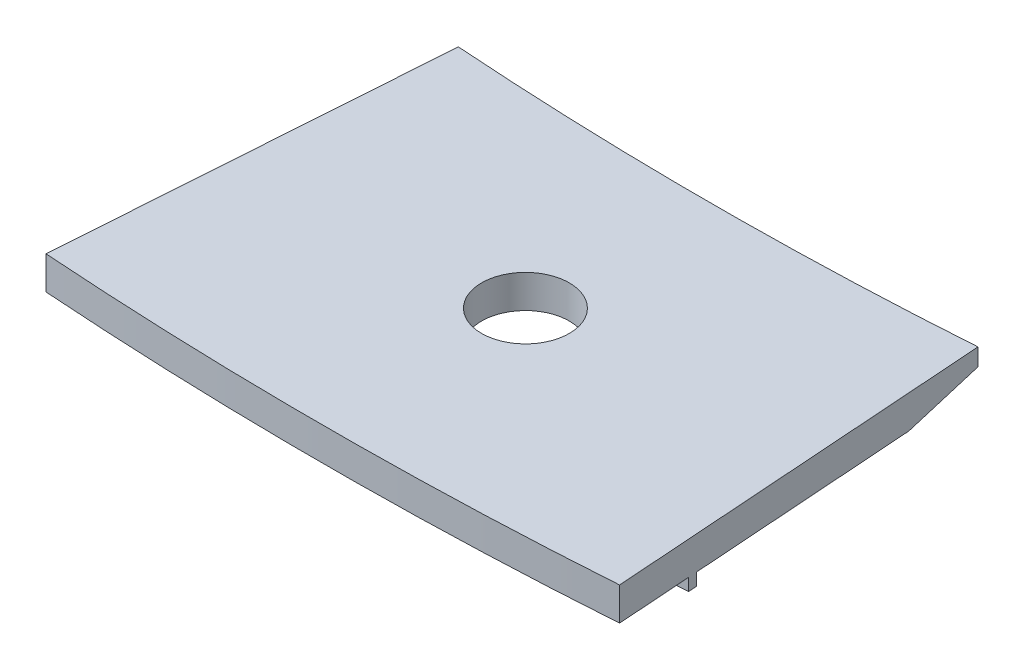
ISO-10303-21;
HEADER;
FILE_DESCRIPTION(('STEP AP214'),'2;1');
FILE_NAME('part.step','',(''),(''),'','','');
FILE_SCHEMA(('AUTOMOTIVE_DESIGN { 1 0 10303 214 1 1 1 1 }'));
ENDSEC;
DATA;
#1=APPLICATION_CONTEXT('core data for automotive mechanical design processes');
#2=APPLICATION_PROTOCOL_DEFINITION('international standard','automotive_design',2000,#1);
#3=PRODUCT_CONTEXT('',#1,'mechanical');
#4=PRODUCT('Part','Part','',(#3));
#5=PRODUCT_RELATED_PRODUCT_CATEGORY('part','',(#4));
#6=PRODUCT_DEFINITION_FORMATION('','',#4);
#7=PRODUCT_DEFINITION_CONTEXT('part definition',#1,'design');
#8=PRODUCT_DEFINITION('design','',#6,#7);
#9=PRODUCT_DEFINITION_SHAPE('','',#8);
#10=(LENGTH_UNIT() NAMED_UNIT(*) SI_UNIT(.MILLI.,.METRE.));
#11=(NAMED_UNIT(*) PLANE_ANGLE_UNIT() SI_UNIT($,.RADIAN.));
#12=(NAMED_UNIT(*) SI_UNIT($,.STERADIAN.) SOLID_ANGLE_UNIT());
#13=UNCERTAINTY_MEASURE_WITH_UNIT(LENGTH_MEASURE(1.E-05),#10,'distance_accuracy_value','');
#14=(GEOMETRIC_REPRESENTATION_CONTEXT(3) GLOBAL_UNCERTAINTY_ASSIGNED_CONTEXT((#13)) GLOBAL_UNIT_ASSIGNED_CONTEXT((#10,
#11,#12)) REPRESENTATION_CONTEXT('',''));
#15=CARTESIAN_POINT('',(0.,0.,0.));
#16=DIRECTION('',(0.,0.,1.));
#17=DIRECTION('',(1.,0.,0.));
#18=AXIS2_PLACEMENT_3D('',#15,#16,#17);
#19=CARTESIAN_POINT('',(4.61295817497898E-12,0.,-3.33066907387441E-13));
#20=DIRECTION('',(0.,-1.,0.));
#21=DIRECTION('',(0.,0.,-1.));
#22=AXIS2_PLACEMENT_3D('',#19,#20,#21);
#23=PLANE('',#22);
#24=CARTESIAN_POINT('',(0.,0.,0.));
#25=DIRECTION('',(0.,1.,0.));
#26=DIRECTION('',(0.,0.,1.));
#27=AXIS2_PLACEMENT_3D('',#24,#25,#26);
#28=CIRCLE('',#27,243.5);
#29=CARTESIAN_POINT('',(-16.9857013566948,0.,242.906846238267));
#30=VERTEX_POINT('',#29);
#31=CARTESIAN_POINT('',(16.9857013566938,0.,242.906846238267));
#32=VERTEX_POINT('',#31);
#33=EDGE_CURVE('E128',#30,#32,#28,.T.);
#34=ORIENTED_EDGE('',*,*,#33,.F.);
#35=DIRECTION('',(-0.069756473744147,0.,0.997564050259823));
#36=VECTOR('',#35,1.);
#37=CARTESIAN_POINT('',(-15.984695958467,0.,228.591802117048));
#38=LINE('',#37,#36);
#39=CARTESIAN_POINT('',(-16.0195741953391,0.,229.090584142178));
#40=VERTEX_POINT('',#39);
#41=EDGE_CURVE('E157',#40,#30,#38,.T.);
#42=ORIENTED_EDGE('',*,*,#41,.F.);
#43=CARTESIAN_POINT('',(0.,0.,0.));
#44=DIRECTION('',(0.,-1.,0.));
#45=DIRECTION('',(0.,0.,-1.));
#46=AXIS2_PLACEMENT_3D('',#43,#44,#45);
#47=CIRCLE('',#46,229.650000000009);
#48=CARTESIAN_POINT('',(16.0195741953391,0.,229.090584142178));
#49=VERTEX_POINT('',#48);
#50=EDGE_CURVE('E44',#40,#49,#47,.F.);
#51=ORIENTED_EDGE('',*,*,#50,.T.);
#52=DIRECTION('',(-0.0697564737440707,0.,-0.997564050259828));
#53=VECTOR('',#52,1.);
#54=CARTESIAN_POINT('',(15.9846959584671,0.,228.591802117049));
#55=LINE('',#54,#53);
#56=EDGE_CURVE('E51',#32,#49,#55,.T.);
#57=ORIENTED_EDGE('',*,*,#56,.F.);
#58=EDGE_LOOP('',(#34,#42,#51,#57));
#59=FACE_BOUND('',#58,.T.);
#60=CARTESIAN_POINT('',(0.,0.,236.25));
#61=DIRECTION('',(0.,1.,0.));
#62=DIRECTION('',(0.,0.,1.));
#63=AXIS2_PLACEMENT_3D('',#60,#61,#62);
#64=CIRCLE('',#63,2.65000000000001);
#65=CARTESIAN_POINT('',(0.,0.,238.9));
#66=VERTEX_POINT('',#65);
#67=EDGE_CURVE('E140',#66,#66,#64,.T.);
#68=ORIENTED_EDGE('',*,*,#67,.T.);
#69=EDGE_LOOP('',(#68));
#70=FACE_BOUND('',#69,.T.);
#71=ADVANCED_FACE('F35',(#59,#70),#23,.T.);
#72=CARTESIAN_POINT('',(4.61295817497898E-12,2.,-3.33066907387441E-13));
#73=DIRECTION('',(0.,-1.,0.));
#74=DIRECTION('',(0.,0.,-1.));
#75=AXIS2_PLACEMENT_3D('',#72,#73,#74);
#76=PLANE('',#75);
#77=DIRECTION('',(-0.0697564737440707,0.,-0.997564050259828));
#78=VECTOR('',#77,1.);
#79=CARTESIAN_POINT('',(15.9846959584671,2.,228.591802117049));
#80=LINE('',#79,#78);
#81=CARTESIAN_POINT('',(17.3344837254145,2.,247.894666489571));
#82=VERTEX_POINT('',#81);
#83=CARTESIAN_POINT('',(15.7056700634948,2.,224.601545916009));
#84=VERTEX_POINT('',#83);
#85=EDGE_CURVE('E153',#82,#84,#80,.T.);
#86=ORIENTED_EDGE('',*,*,#85,.T.);
#87=CARTESIAN_POINT('',(0.,2.,0.));
#88=DIRECTION('',(0.,-1.,0.));
#89=DIRECTION('',(0.,0.,-1.));
#90=AXIS2_PLACEMENT_3D('',#87,#88,#89);
#91=CIRCLE('',#90,225.150000000009);
#92=CARTESIAN_POINT('',(-15.7056700634852,2.,224.601545916009));
#93=VERTEX_POINT('',#92);
#94=EDGE_CURVE('E129',#84,#93,#91,.T.);
#95=ORIENTED_EDGE('',*,*,#94,.T.);
#96=DIRECTION('',(-0.069756473744147,0.,0.997564050259823));
#97=VECTOR('',#96,1.);
#98=CARTESIAN_POINT('',(-15.984695958467,2.,228.591802117048));
#99=LINE('',#98,#97);
#100=CARTESIAN_POINT('',(-17.3344837254159,2.,247.894666489571));
#101=VERTEX_POINT('',#100);
#102=EDGE_CURVE('E148',#93,#101,#99,.T.);
#103=ORIENTED_EDGE('',*,*,#102,.T.);
#104=CARTESIAN_POINT('',(4.63518112781003E-12,2.,0.));
#105=DIRECTION('',(0.,1.,0.));
#106=DIRECTION('',(0.,0.,-1.));
#107=AXIS2_PLACEMENT_3D('',#104,#105,#106);
#108=CIRCLE('',#107,248.500000000005);
#109=EDGE_CURVE('E150',#101,#82,#108,.T.);
#110=ORIENTED_EDGE('',*,*,#109,.T.);
#111=EDGE_LOOP('',(#86,#95,#103,#110));
#112=FACE_BOUND('',#111,.T.);
#113=CARTESIAN_POINT('',(0.,2.,236.25));
#114=DIRECTION('',(0.,1.,0.));
#115=DIRECTION('',(0.,0.,1.));
#116=AXIS2_PLACEMENT_3D('',#113,#114,#115);
#117=CIRCLE('',#116,2.65000000000001);
#118=CARTESIAN_POINT('',(0.,2.,238.9));
#119=VERTEX_POINT('',#118);
#120=EDGE_CURVE('E142',#119,#119,#117,.T.);
#121=ORIENTED_EDGE('',*,*,#120,.F.);
#122=EDGE_LOOP('',(#121));
#123=FACE_BOUND('',#122,.T.);
#124=ADVANCED_FACE('F186',(#112,#123),#76,.F.);
#125=CARTESIAN_POINT('',(0.,0.,0.));
#126=DIRECTION('',(0.,-1.,0.));
#127=DIRECTION('',(0.,0.,1.));
#128=AXIS2_PLACEMENT_3D('',#125,#126,#127);
#129=CIRCLE('',#128,244.001220949041);
#130=CARTESIAN_POINT('',(17.0206647626656,0.,243.406846238267));
#131=VERTEX_POINT('',#130);
#132=CARTESIAN_POINT('',(-17.0206647626666,0.,243.406846238267));
#133=VERTEX_POINT('',#132);
#134=EDGE_CURVE('E59',#131,#133,#129,.T.);
#135=ORIENTED_EDGE('',*,*,#134,.F.);
#136=CARTESIAN_POINT('',(17.3344837254145,0.,247.894666489571));
#137=VERTEX_POINT('',#136);
#138=EDGE_CURVE('E151',#137,#131,#55,.T.);
#139=ORIENTED_EDGE('',*,*,#138,.F.);
#140=CARTESIAN_POINT('',(4.63518112781003E-12,0.,0.));
#141=DIRECTION('',(0.,1.,0.));
#142=DIRECTION('',(0.,0.,-1.));
#143=AXIS2_PLACEMENT_3D('',#140,#141,#142);
#144=CIRCLE('',#143,248.500000000005);
#145=CARTESIAN_POINT('',(-17.3344837254159,0.,247.894666489571));
#146=VERTEX_POINT('',#145);
#147=EDGE_CURVE('E160',#146,#137,#144,.T.);
#148=ORIENTED_EDGE('',*,*,#147,.F.);
#149=EDGE_CURVE('E145',#133,#146,#38,.T.);
#150=ORIENTED_EDGE('',*,*,#149,.F.);
#151=EDGE_LOOP('',(#135,#139,#148,#150));
#152=FACE_BOUND('',#151,.T.);
#153=ADVANCED_FACE('F193',(#152),#23,.T.);
#154=CARTESIAN_POINT('',(-15.984695958467,2.,228.591802117048));
#155=DIRECTION('',(0.997564050259823,0.,0.069756473744147));
#156=DIRECTION('',(0.069756473744147,0.,-0.997564050259823));
#157=AXIS2_PLACEMENT_3D('',#154,#155,#156);
#158=PLANE('',#157);
#159=DIRECTION('',(0.,1.,0.));
#160=VECTOR('',#159,1.);
#161=CARTESIAN_POINT('',(-15.7056700634852,0.,224.601545916009));
#162=LINE('',#161,#160);
#163=CARTESIAN_POINT('',(-15.7056700634852,0.956504527515105,224.601545916009));
#164=VERTEX_POINT('',#163);
#165=EDGE_CURVE('E138',#164,#93,#162,.T.);
#166=ORIENTED_EDGE('',*,*,#165,.F.);
#167=DIRECTION('',(-0.0682321274284881,-0.207911690817757,0.975764882339944));
#168=VECTOR('',#167,1.);
#169=CARTESIAN_POINT('',(4.9561456326871E-12,48.8136143875219,3.46567463621669E-13));
#170=LINE('',#169,#168);
#171=EDGE_CURVE('E171',#164,#40,#170,.T.);
#172=ORIENTED_EDGE('',*,*,#171,.T.);
#173=ORIENTED_EDGE('',*,*,#41,.T.);
#174=DIRECTION('',(0.,1.,0.));
#175=VECTOR('',#174,1.);
#176=CARTESIAN_POINT('',(-16.9857013566945,-0.75,242.906846238267));
#177=LINE('',#176,#175);
#178=CARTESIAN_POINT('',(-16.9857013566945,-0.75,242.906846238267));
#179=VERTEX_POINT('',#178);
#180=EDGE_CURVE('E200',#179,#30,#177,.T.);
#181=ORIENTED_EDGE('',*,*,#180,.F.);
#182=DIRECTION('',(0.069756473744752,0.,-0.99756405025978));
#183=VECTOR('',#182,1.);
#184=CARTESIAN_POINT('',(-17.0206647626666,-0.75,243.406846238267));
#185=LINE('',#184,#183);
#186=CARTESIAN_POINT('',(-17.0206647626666,-0.75,243.406846238267));
#187=VERTEX_POINT('',#186);
#188=EDGE_CURVE('E122',#187,#179,#185,.T.);
#189=ORIENTED_EDGE('',*,*,#188,.F.);
#190=DIRECTION('',(0.,1.,0.));
#191=VECTOR('',#190,1.);
#192=CARTESIAN_POINT('',(-17.0206647626666,-0.75,243.406846238267));
#193=LINE('',#192,#191);
#194=EDGE_CURVE('E134',#187,#133,#193,.T.);
#195=ORIENTED_EDGE('',*,*,#194,.T.);
#196=ORIENTED_EDGE('',*,*,#149,.T.);
#197=DIRECTION('',(0.,-1.,0.));
#198=VECTOR('',#197,1.);
#199=CARTESIAN_POINT('',(-17.3344837254159,2.,247.894666489571));
#200=LINE('',#199,#198);
#201=EDGE_CURVE('E165',#101,#146,#200,.T.);
#202=ORIENTED_EDGE('',*,*,#201,.F.);
#203=ORIENTED_EDGE('',*,*,#102,.F.);
#204=EDGE_LOOP('',(#166,#172,#173,#181,#189,#195,#196,#202,#203));
#205=FACE_BOUND('',#204,.T.);
#206=ADVANCED_FACE('F196',(#205),#158,.F.);
#207=CARTESIAN_POINT('',(4.63518112781003E-12,2.,0.));
#208=DIRECTION('',(0.,-1.,0.));
#209=DIRECTION('',(0.,0.,-1.));
#210=AXIS2_PLACEMENT_3D('',#207,#208,#209);
#211=CYLINDRICAL_SURFACE('',#210,248.500000000005);
#212=ORIENTED_EDGE('',*,*,#147,.T.);
#213=DIRECTION('',(0.,-1.,0.));
#214=VECTOR('',#213,1.);
#215=CARTESIAN_POINT('',(17.3344837254145,2.,247.894666489571));
#216=LINE('',#215,#214);
#217=EDGE_CURVE('E156',#82,#137,#216,.T.);
#218=ORIENTED_EDGE('',*,*,#217,.F.);
#219=ORIENTED_EDGE('',*,*,#109,.F.);
#220=ORIENTED_EDGE('',*,*,#201,.T.);
#221=EDGE_LOOP('',(#212,#218,#219,#220));
#222=FACE_BOUND('',#221,.T.);
#223=ADVANCED_FACE('F194',(#222),#211,.T.);
#224=CARTESIAN_POINT('',(15.9846959584671,2.,228.591802117049));
#225=DIRECTION('',(-0.997564050259828,0.,0.0697564737440707));
#226=DIRECTION('',(0.0697564737440707,0.,0.997564050259828));
#227=AXIS2_PLACEMENT_3D('',#224,#225,#226);
#228=PLANE('',#227);
#229=ORIENTED_EDGE('',*,*,#138,.T.);
#230=DIRECTION('',(0.,1.,0.));
#231=VECTOR('',#230,1.);
#232=CARTESIAN_POINT('',(17.0206647626656,-0.75,243.406846238267));
#233=LINE('',#232,#231);
#234=CARTESIAN_POINT('',(17.0206647626656,-0.75,243.406846238267));
#235=VERTEX_POINT('',#234);
#236=EDGE_CURVE('E113',#235,#131,#233,.T.);
#237=ORIENTED_EDGE('',*,*,#236,.F.);
#238=DIRECTION('',(0.0697564737425186,0.,0.997564050259937));
#239=VECTOR('',#238,1.);
#240=CARTESIAN_POINT('',(17.0206647626656,-0.75,243.406846238267));
#241=LINE('',#240,#239);
#242=CARTESIAN_POINT('',(16.9857013566946,-0.75,242.906846238267));
#243=VERTEX_POINT('',#242);
#244=EDGE_CURVE('E106',#243,#235,#241,.T.);
#245=ORIENTED_EDGE('',*,*,#244,.F.);
#246=DIRECTION('',(0.,1.,0.));
#247=VECTOR('',#246,1.);
#248=CARTESIAN_POINT('',(16.9857013566946,-0.75,242.906846238267));
#249=LINE('',#248,#247);
#250=EDGE_CURVE('E110',#243,#32,#249,.T.);
#251=ORIENTED_EDGE('',*,*,#250,.T.);
#252=ORIENTED_EDGE('',*,*,#56,.T.);
#253=DIRECTION('',(-0.0682321274284135,0.207911690817757,-0.975764882339949));
#254=VECTOR('',#253,1.);
#255=CARTESIAN_POINT('',(1.26187897882523E-11,48.8136143875219,-8.82391740477112E-13));
#256=LINE('',#255,#254);
#257=CARTESIAN_POINT('',(15.7056700634948,0.956504527515105,224.601545916009));
#258=VERTEX_POINT('',#257);
#259=EDGE_CURVE('E11',#49,#258,#256,.T.);
#260=ORIENTED_EDGE('',*,*,#259,.T.);
#261=DIRECTION('',(0.,1.,0.));
#262=VECTOR('',#261,1.);
#263=CARTESIAN_POINT('',(15.7056700634948,0.,224.601545916009));
#264=LINE('',#263,#262);
#265=EDGE_CURVE('E132',#258,#84,#264,.T.);
#266=ORIENTED_EDGE('',*,*,#265,.T.);
#267=ORIENTED_EDGE('',*,*,#85,.F.);
#268=ORIENTED_EDGE('',*,*,#217,.T.);
#269=EDGE_LOOP('',(#229,#237,#245,#251,#252,#260,#266,#267,#268));
#270=FACE_BOUND('',#269,.T.);
#271=ADVANCED_FACE('F108',(#270),#228,.F.);
#272=CARTESIAN_POINT('',(0.,2.,236.25));
#273=DIRECTION('',(0.,-1.,0.));
#274=DIRECTION('',(0.,0.,-1.));
#275=AXIS2_PLACEMENT_3D('',#272,#273,#274);
#276=CYLINDRICAL_SURFACE('',#275,2.65000000000001);
#277=ORIENTED_EDGE('',*,*,#120,.T.);
#278=EDGE_LOOP('',(#277));
#279=FACE_BOUND('',#278,.T.);
#280=ORIENTED_EDGE('',*,*,#67,.F.);
#281=EDGE_LOOP('',(#280));
#282=FACE_BOUND('',#281,.T.);
#283=ADVANCED_FACE('F231',(#279,#282),#276,.F.);
#284=CARTESIAN_POINT('',(0.,0.,0.));
#285=DIRECTION('',(0.,1.,0.));
#286=DIRECTION('',(0.,0.,1.));
#287=AXIS2_PLACEMENT_3D('',#284,#285,#286);
#288=CYLINDRICAL_SURFACE('',#287,225.150000000009);
#289=ORIENTED_EDGE('',*,*,#265,.F.);
#290=CARTESIAN_POINT('',(0.,0.956504527515105,0.));
#291=DIRECTION('',(0.,-1.,0.));
#292=DIRECTION('',(0.,0.,-1.));
#293=AXIS2_PLACEMENT_3D('',#290,#291,#292);
#294=CIRCLE('',#293,225.150000000009);
#295=EDGE_CURVE('E168',#258,#164,#294,.T.);
#296=ORIENTED_EDGE('',*,*,#295,.T.);
#297=ORIENTED_EDGE('',*,*,#165,.T.);
#298=ORIENTED_EDGE('',*,*,#94,.F.);
#299=EDGE_LOOP('',(#289,#296,#297,#298));
#300=FACE_BOUND('',#299,.T.);
#301=ADVANCED_FACE('F182',(#300),#288,.F.);
#302=CARTESIAN_POINT('',(0.,0.956504527515105,0.));
#303=DIRECTION('',(0.,-1.,0.));
#304=DIRECTION('',(0.,0.,-1.));
#305=AXIS2_PLACEMENT_3D('',#302,#303,#304);
#306=CONICAL_SURFACE('',#305,225.150000000009,1.36135681655558);
#307=ORIENTED_EDGE('',*,*,#259,.F.);
#308=ORIENTED_EDGE('',*,*,#50,.F.);
#309=ORIENTED_EDGE('',*,*,#171,.F.);
#310=ORIENTED_EDGE('',*,*,#295,.F.);
#311=EDGE_LOOP('',(#307,#308,#309,#310));
#312=FACE_BOUND('',#311,.T.);
#313=ADVANCED_FACE('F38',(#312),#306,.F.);
#314=CARTESIAN_POINT('',(0.,-0.75,0.));
#315=DIRECTION('',(0.,1.,0.));
#316=DIRECTION('',(0.,0.,1.));
#317=AXIS2_PLACEMENT_3D('',#314,#315,#316);
#318=CYLINDRICAL_SURFACE('',#317,243.5);
#319=ORIENTED_EDGE('',*,*,#33,.T.);
#320=ORIENTED_EDGE('',*,*,#250,.F.);
#321=CARTESIAN_POINT('',(0.,-0.75,0.));
#322=DIRECTION('',(0.,1.,0.));
#323=DIRECTION('',(0.,0.,1.));
#324=AXIS2_PLACEMENT_3D('',#321,#322,#323);
#325=CIRCLE('',#324,243.5);
#326=EDGE_CURVE('E117',#179,#243,#325,.T.);
#327=ORIENTED_EDGE('',*,*,#326,.F.);
#328=ORIENTED_EDGE('',*,*,#180,.T.);
#329=EDGE_LOOP('',(#319,#320,#327,#328));
#330=FACE_BOUND('',#329,.T.);
#331=ADVANCED_FACE('F127',(#330),#318,.F.);
#332=CARTESIAN_POINT('',(0.,-0.75,0.));
#333=DIRECTION('',(0.,1.,0.));
#334=DIRECTION('',(0.,0.,1.));
#335=AXIS2_PLACEMENT_3D('',#332,#333,#334);
#336=CYLINDRICAL_SURFACE('',#335,244.001220949041);
#337=ORIENTED_EDGE('',*,*,#134,.T.);
#338=ORIENTED_EDGE('',*,*,#194,.F.);
#339=CARTESIAN_POINT('',(0.,-0.75,0.));
#340=DIRECTION('',(0.,-1.,0.));
#341=DIRECTION('',(0.,0.,1.));
#342=AXIS2_PLACEMENT_3D('',#339,#340,#341);
#343=CIRCLE('',#342,244.001220949041);
#344=EDGE_CURVE('E116',#235,#187,#343,.T.);
#345=ORIENTED_EDGE('',*,*,#344,.F.);
#346=ORIENTED_EDGE('',*,*,#236,.T.);
#347=EDGE_LOOP('',(#337,#338,#345,#346));
#348=FACE_BOUND('',#347,.T.);
#349=ADVANCED_FACE('F206',(#348),#336,.T.);
#350=CARTESIAN_POINT('',(0.,-0.75,0.));
#351=DIRECTION('',(0.,1.,0.));
#352=DIRECTION('',(0.,0.,1.));
#353=AXIS2_PLACEMENT_3D('',#350,#351,#352);
#354=PLANE('',#353);
#355=ORIENTED_EDGE('',*,*,#326,.T.);
#356=ORIENTED_EDGE('',*,*,#244,.T.);
#357=ORIENTED_EDGE('',*,*,#344,.T.);
#358=ORIENTED_EDGE('',*,*,#188,.T.);
#359=EDGE_LOOP('',(#355,#356,#357,#358));
#360=FACE_BOUND('',#359,.T.);
#361=ADVANCED_FACE('F120',(#360),#354,.F.);
#362=CLOSED_SHELL('',(#71,#124,#153,#206,#223,#271,#283,#301,#313,#331,#349,#361));
#363=MANIFOLD_SOLID_BREP('B2',#362);
#364=ADVANCED_BREP_SHAPE_REPRESENTATION('',(#18,#363),#14);
#365=SHAPE_DEFINITION_REPRESENTATION(#9,#364);
ENDSEC;
END-ISO-10303-21;
